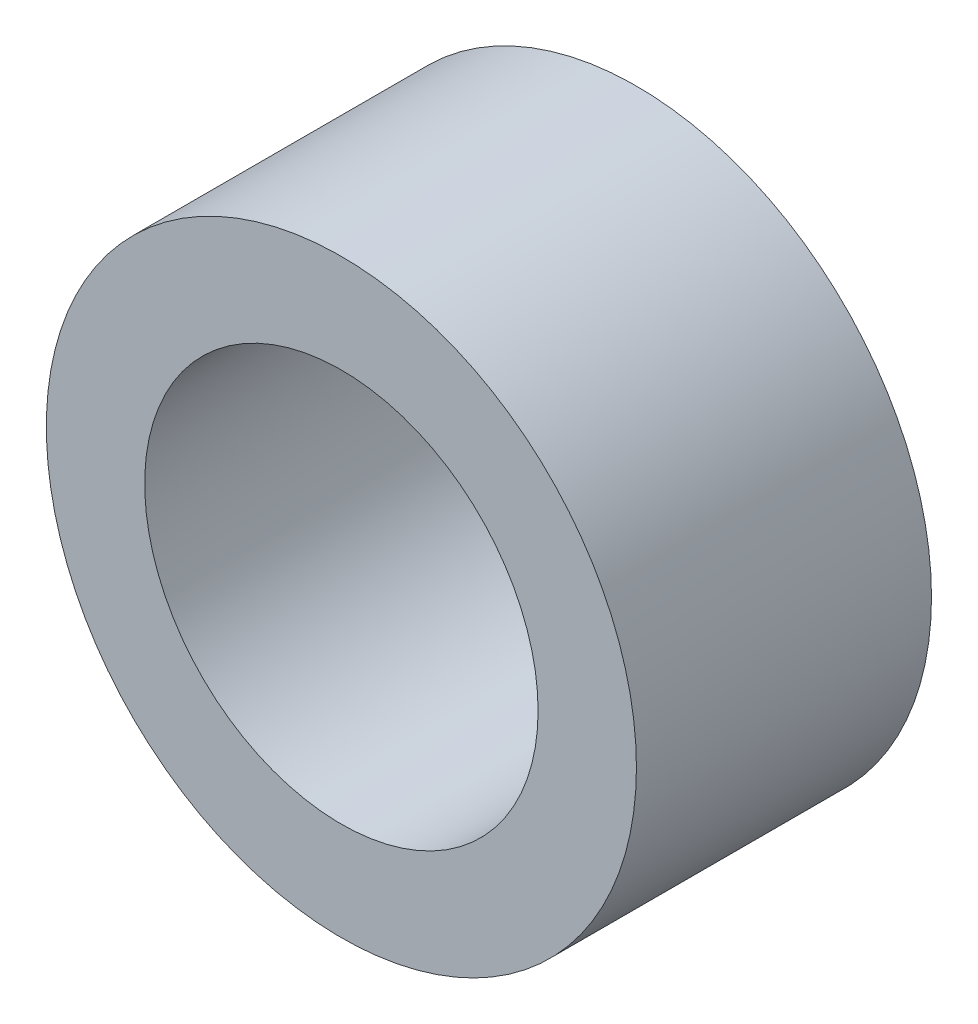
ISO-10303-21;
HEADER;
FILE_DESCRIPTION(('STEP AP214'),'2;1');
FILE_NAME('part.step','',(''),(''),'','','');
FILE_SCHEMA(('AUTOMOTIVE_DESIGN { 1 0 10303 214 1 1 1 1 }'));
ENDSEC;
DATA;
#1=APPLICATION_CONTEXT('core data for automotive mechanical design processes');
#2=APPLICATION_PROTOCOL_DEFINITION('international standard','automotive_design',2000,#1);
#3=PRODUCT_CONTEXT('',#1,'mechanical');
#4=PRODUCT('Part','Part','',(#3));
#5=PRODUCT_RELATED_PRODUCT_CATEGORY('part','',(#4));
#6=PRODUCT_DEFINITION_FORMATION('','',#4);
#7=PRODUCT_DEFINITION_CONTEXT('part definition',#1,'design');
#8=PRODUCT_DEFINITION('design','',#6,#7);
#9=PRODUCT_DEFINITION_SHAPE('','',#8);
#10=(LENGTH_UNIT() NAMED_UNIT(*) SI_UNIT(.MILLI.,.METRE.));
#11=(NAMED_UNIT(*) PLANE_ANGLE_UNIT() SI_UNIT($,.RADIAN.));
#12=(NAMED_UNIT(*) SI_UNIT($,.STERADIAN.) SOLID_ANGLE_UNIT());
#13=UNCERTAINTY_MEASURE_WITH_UNIT(LENGTH_MEASURE(1.E-05),#10,'distance_accuracy_value','');
#14=(GEOMETRIC_REPRESENTATION_CONTEXT(3) GLOBAL_UNCERTAINTY_ASSIGNED_CONTEXT((#13)) GLOBAL_UNIT_ASSIGNED_CONTEXT((#10,
#11,#12)) REPRESENTATION_CONTEXT('',''));
#15=CARTESIAN_POINT('',(0.,0.,0.));
#16=DIRECTION('',(0.,0.,1.));
#17=DIRECTION('',(1.,0.,0.));
#18=AXIS2_PLACEMENT_3D('',#15,#16,#17);
#19=CARTESIAN_POINT('',(0.,0.,-19.05));
#20=DIRECTION('',(0.,0.,1.));
#21=DIRECTION('',(1.,0.,0.));
#22=AXIS2_PLACEMENT_3D('',#19,#20,#21);
#23=CYLINDRICAL_SURFACE('',#22,38.1);
#24=CARTESIAN_POINT('',(0.,0.,-19.05));
#25=DIRECTION('',(0.,0.,1.));
#26=DIRECTION('',(1.,0.,0.));
#27=AXIS2_PLACEMENT_3D('',#24,#25,#26);
#28=CIRCLE('',#27,38.1);
#29=CARTESIAN_POINT('',(38.1,0.,-19.05));
#30=VERTEX_POINT('',#29);
#31=EDGE_CURVE('E10',#30,#30,#28,.T.);
#32=CARTESIAN_POINT('',(0.,0.,19.05));
#33=DIRECTION('',(0.,0.,1.));
#34=DIRECTION('',(1.,0.,0.));
#35=AXIS2_PLACEMENT_3D('',#32,#33,#34);
#36=CIRCLE('',#35,38.1);
#37=CARTESIAN_POINT('',(38.1,0.,19.05));
#38=VERTEX_POINT('',#37);
#39=EDGE_CURVE('E40',#38,#38,#36,.T.);
#40=CARTESIAN_POINT('',(38.1,0.,-19.05));
#41=CARTESIAN_POINT('',(38.1,0.,-18.653125));
#42=CARTESIAN_POINT('',(38.1,0.,-18.25625));
#43=CARTESIAN_POINT('',(38.1,0.,-17.4625));
#44=CARTESIAN_POINT('',(38.1,0.,-17.065625));
#45=CARTESIAN_POINT('',(38.1,0.,-16.271875));
#46=CARTESIAN_POINT('',(38.1,0.,-15.875));
#47=CARTESIAN_POINT('',(38.1,0.,-15.08125));
#48=CARTESIAN_POINT('',(38.1,0.,-14.684375));
#49=CARTESIAN_POINT('',(38.1,0.,-13.890625));
#50=CARTESIAN_POINT('',(38.1,0.,-13.49375));
#51=CARTESIAN_POINT('',(38.1,0.,-12.7));
#52=CARTESIAN_POINT('',(38.1,0.,-12.303125));
#53=CARTESIAN_POINT('',(38.1,0.,-11.509375));
#54=CARTESIAN_POINT('',(38.1,0.,-11.1125));
#55=CARTESIAN_POINT('',(38.1,0.,-10.31875));
#56=CARTESIAN_POINT('',(38.1,0.,-9.921875));
#57=CARTESIAN_POINT('',(38.1,0.,-9.128125));
#58=CARTESIAN_POINT('',(38.1,0.,-8.73125));
#59=CARTESIAN_POINT('',(38.1,0.,-7.9375));
#60=CARTESIAN_POINT('',(38.1,0.,-7.540625));
#61=CARTESIAN_POINT('',(38.1,0.,-6.746875));
#62=CARTESIAN_POINT('',(38.1,0.,-6.35));
#63=CARTESIAN_POINT('',(38.1,0.,-5.55625));
#64=CARTESIAN_POINT('',(38.1,0.,-5.159375));
#65=CARTESIAN_POINT('',(38.1,0.,-4.365625));
#66=CARTESIAN_POINT('',(38.1,0.,-3.96875));
#67=CARTESIAN_POINT('',(38.1,0.,-3.175));
#68=CARTESIAN_POINT('',(38.1,0.,-2.778125));
#69=CARTESIAN_POINT('',(38.1,0.,-1.984375));
#70=CARTESIAN_POINT('',(38.1,0.,-1.5875));
#71=CARTESIAN_POINT('',(38.1,0.,-0.79375));
#72=CARTESIAN_POINT('',(38.1,0.,-0.396875));
#73=CARTESIAN_POINT('',(38.1,0.,0.396875));
#74=CARTESIAN_POINT('',(38.1,0.,0.79375));
#75=CARTESIAN_POINT('',(38.1,0.,1.5875));
#76=CARTESIAN_POINT('',(38.1,0.,1.984375));
#77=CARTESIAN_POINT('',(38.1,0.,2.778125));
#78=CARTESIAN_POINT('',(38.1,0.,3.175));
#79=CARTESIAN_POINT('',(38.1,0.,3.96875));
#80=CARTESIAN_POINT('',(38.1,0.,4.365625));
#81=CARTESIAN_POINT('',(38.1,0.,5.159375));
#82=CARTESIAN_POINT('',(38.1,0.,5.55625));
#83=CARTESIAN_POINT('',(38.1,0.,6.35));
#84=CARTESIAN_POINT('',(38.1,0.,6.746875));
#85=CARTESIAN_POINT('',(38.1,0.,7.540625));
#86=CARTESIAN_POINT('',(38.1,0.,7.9375));
#87=CARTESIAN_POINT('',(38.1,0.,8.73125));
#88=CARTESIAN_POINT('',(38.1,0.,9.128125));
#89=CARTESIAN_POINT('',(38.1,0.,9.921875));
#90=CARTESIAN_POINT('',(38.1,0.,10.31875));
#91=CARTESIAN_POINT('',(38.1,0.,11.1125));
#92=CARTESIAN_POINT('',(38.1,0.,11.509375));
#93=CARTESIAN_POINT('',(38.1,0.,12.303125));
#94=CARTESIAN_POINT('',(38.1,0.,12.7));
#95=CARTESIAN_POINT('',(38.1,0.,13.49375));
#96=CARTESIAN_POINT('',(38.1,0.,13.890625));
#97=CARTESIAN_POINT('',(38.1,0.,14.684375));
#98=CARTESIAN_POINT('',(38.1,0.,15.08125));
#99=CARTESIAN_POINT('',(38.1,0.,15.875));
#100=CARTESIAN_POINT('',(38.1,0.,16.271875));
#101=CARTESIAN_POINT('',(38.1,0.,17.065625));
#102=CARTESIAN_POINT('',(38.1,0.,17.4625));
#103=CARTESIAN_POINT('',(38.1,0.,18.25625));
#104=CARTESIAN_POINT('',(38.1,0.,18.653125));
#105=CARTESIAN_POINT('',(38.1,0.,19.05));
#106=B_SPLINE_CURVE_WITH_KNOTS('',3,(#40,#41,#42,#43,#44,#45,#46,#47,#48,#49,#50,#51,#52,#53,
#54,#55,#56,#57,#58,#59,#60,#61,#62,#63,#64,#65,#66,#67,#68,#69,#70,#71,#72,#73,#74,#75,#76,#77,
#78,#79,#80,#81,#82,#83,#84,#85,#86,#87,#88,#89,#90,#91,#92,#93,#94,#95,#96,#97,#98,#99,#100,
#101,#102,#103,#104,#105),.UNSPECIFIED.,.F.,.F.,(4,2,2,2,2,2,2,2,2,2,2,2,2,2,2,2,2,2,2,2,2,2,2,
2,2,2,2,2,2,2,2,2,4),(0.,1.190625,2.38125,3.571875,4.7625,5.953125,7.14375,8.334375,9.525,
10.715625,11.90625,13.096875,14.2875,15.478125,16.66875,17.859375,19.05,20.240625,21.43125,
22.621875,23.8125,25.003125,26.19375,27.384375,28.575,29.765625,30.95625,32.146875,33.3375,
34.528125,35.71875,36.909375,38.1),.UNSPECIFIED.);
#107=EDGE_CURVE('BSEAM37',#30,#38,#106,.T.);
#108=ORIENTED_EDGE('',*,*,#31,.T.);
#109=ORIENTED_EDGE('',*,*,#39,.F.);
#110=ORIENTED_EDGE('',*,*,#107,.T.);
#111=ORIENTED_EDGE('',*,*,#107,.F.);
#112=EDGE_LOOP('',(#108,#110,#109,#111));
#113=FACE_BOUND('',#112,.T.);
#114=ADVANCED_FACE('F37',(#113),#23,.T.);
#115=CARTESIAN_POINT('',(0.,0.,-19.05));
#116=DIRECTION('',(0.,0.,1.));
#117=DIRECTION('',(1.,0.,0.));
#118=AXIS2_PLACEMENT_3D('',#115,#116,#117);
#119=PLANE('',#118);
#120=CARTESIAN_POINT('',(0.,0.,-19.05));
#121=DIRECTION('',(0.,0.,1.));
#122=DIRECTION('',(1.,0.,0.));
#123=AXIS2_PLACEMENT_3D('',#120,#121,#122);
#124=CIRCLE('',#123,25.4);
#125=CARTESIAN_POINT('',(25.4,0.,-19.05));
#126=VERTEX_POINT('',#125);
#127=EDGE_CURVE('E49',#126,#126,#124,.T.);
#128=ORIENTED_EDGE('',*,*,#127,.T.);
#129=EDGE_LOOP('',(#128));
#130=FACE_BOUND('',#129,.T.);
#131=ORIENTED_EDGE('',*,*,#31,.F.);
#132=EDGE_LOOP('',(#131));
#133=FACE_BOUND('',#132,.T.);
#134=ADVANCED_FACE('F59',(#130,#133),#119,.F.);
#135=CARTESIAN_POINT('',(0.,0.,19.05));
#136=DIRECTION('',(0.,0.,1.));
#137=DIRECTION('',(1.,0.,0.));
#138=AXIS2_PLACEMENT_3D('',#135,#136,#137);
#139=PLANE('',#138);
#140=CARTESIAN_POINT('',(0.,0.,19.05));
#141=DIRECTION('',(0.,0.,1.));
#142=DIRECTION('',(1.,0.,0.));
#143=AXIS2_PLACEMENT_3D('',#140,#141,#142);
#144=CIRCLE('',#143,25.4);
#145=CARTESIAN_POINT('',(25.4,0.,19.05));
#146=VERTEX_POINT('',#145);
#147=EDGE_CURVE('E51',#146,#146,#144,.T.);
#148=ORIENTED_EDGE('',*,*,#147,.F.);
#149=EDGE_LOOP('',(#148));
#150=FACE_BOUND('',#149,.T.);
#151=ORIENTED_EDGE('',*,*,#39,.T.);
#152=EDGE_LOOP('',(#151));
#153=FACE_BOUND('',#152,.T.);
#154=ADVANCED_FACE('F65',(#150,#153),#139,.T.);
#155=CARTESIAN_POINT('',(0.,0.,-19.05));
#156=DIRECTION('',(0.,0.,1.));
#157=DIRECTION('',(1.,0.,0.));
#158=AXIS2_PLACEMENT_3D('',#155,#156,#157);
#159=CYLINDRICAL_SURFACE('',#158,25.4);
#160=CARTESIAN_POINT('',(25.4,0.,-19.05));
#161=CARTESIAN_POINT('',(25.4,0.,-18.653125));
#162=CARTESIAN_POINT('',(25.4,0.,-18.25625));
#163=CARTESIAN_POINT('',(25.4,0.,-17.4625));
#164=CARTESIAN_POINT('',(25.4,0.,-17.065625));
#165=CARTESIAN_POINT('',(25.4,0.,-16.271875));
#166=CARTESIAN_POINT('',(25.4,0.,-15.875));
#167=CARTESIAN_POINT('',(25.4,0.,-15.08125));
#168=CARTESIAN_POINT('',(25.4,0.,-14.684375));
#169=CARTESIAN_POINT('',(25.4,0.,-13.890625));
#170=CARTESIAN_POINT('',(25.4,0.,-13.49375));
#171=CARTESIAN_POINT('',(25.4,0.,-12.7));
#172=CARTESIAN_POINT('',(25.4,0.,-12.303125));
#173=CARTESIAN_POINT('',(25.4,0.,-11.509375));
#174=CARTESIAN_POINT('',(25.4,0.,-11.1125));
#175=CARTESIAN_POINT('',(25.4,0.,-10.31875));
#176=CARTESIAN_POINT('',(25.4,0.,-9.921875));
#177=CARTESIAN_POINT('',(25.4,0.,-9.128125));
#178=CARTESIAN_POINT('',(25.4,0.,-8.73125));
#179=CARTESIAN_POINT('',(25.4,0.,-7.9375));
#180=CARTESIAN_POINT('',(25.4,0.,-7.540625));
#181=CARTESIAN_POINT('',(25.4,0.,-6.746875));
#182=CARTESIAN_POINT('',(25.4,0.,-6.35));
#183=CARTESIAN_POINT('',(25.4,0.,-5.55625));
#184=CARTESIAN_POINT('',(25.4,0.,-5.159375));
#185=CARTESIAN_POINT('',(25.4,0.,-4.365625));
#186=CARTESIAN_POINT('',(25.4,0.,-3.96875));
#187=CARTESIAN_POINT('',(25.4,0.,-3.175));
#188=CARTESIAN_POINT('',(25.4,0.,-2.778125));
#189=CARTESIAN_POINT('',(25.4,0.,-1.984375));
#190=CARTESIAN_POINT('',(25.4,0.,-1.5875));
#191=CARTESIAN_POINT('',(25.4,0.,-0.793750000000004));
#192=CARTESIAN_POINT('',(25.4,0.,-0.396875000000004));
#193=CARTESIAN_POINT('',(25.4,0.,0.396874999999997));
#194=CARTESIAN_POINT('',(25.4,0.,0.793749999999997));
#195=CARTESIAN_POINT('',(25.4,0.,1.5875));
#196=CARTESIAN_POINT('',(25.4,0.,1.984375));
#197=CARTESIAN_POINT('',(25.4,0.,2.778125));
#198=CARTESIAN_POINT('',(25.4,0.,3.175));
#199=CARTESIAN_POINT('',(25.4,0.,3.96875));
#200=CARTESIAN_POINT('',(25.4,0.,4.365625));
#201=CARTESIAN_POINT('',(25.4,0.,5.159375));
#202=CARTESIAN_POINT('',(25.4,0.,5.55625));
#203=CARTESIAN_POINT('',(25.4,0.,6.35));
#204=CARTESIAN_POINT('',(25.4,0.,6.746875));
#205=CARTESIAN_POINT('',(25.4,0.,7.540625));
#206=CARTESIAN_POINT('',(25.4,0.,7.9375));
#207=CARTESIAN_POINT('',(25.4,0.,8.73125));
#208=CARTESIAN_POINT('',(25.4,0.,9.128125));
#209=CARTESIAN_POINT('',(25.4,0.,9.921875));
#210=CARTESIAN_POINT('',(25.4,0.,10.31875));
#211=CARTESIAN_POINT('',(25.4,0.,11.1125));
#212=CARTESIAN_POINT('',(25.4,0.,11.509375));
#213=CARTESIAN_POINT('',(25.4,0.,12.303125));
#214=CARTESIAN_POINT('',(25.4,0.,12.7));
#215=CARTESIAN_POINT('',(25.4,0.,13.49375));
#216=CARTESIAN_POINT('',(25.4,0.,13.890625));
#217=CARTESIAN_POINT('',(25.4,0.,14.684375));
#218=CARTESIAN_POINT('',(25.4,0.,15.08125));
#219=CARTESIAN_POINT('',(25.4,0.,15.875));
#220=CARTESIAN_POINT('',(25.4,0.,16.271875));
#221=CARTESIAN_POINT('',(25.4,0.,17.065625));
#222=CARTESIAN_POINT('',(25.4,0.,17.4625));
#223=CARTESIAN_POINT('',(25.4,0.,18.25625));
#224=CARTESIAN_POINT('',(25.4,0.,18.653125));
#225=CARTESIAN_POINT('',(25.4,0.,19.05));
#226=B_SPLINE_CURVE_WITH_KNOTS('',3,(#160,#161,#162,#163,#164,#165,#166,#167,#168,#169,#170,
#171,#172,#173,#174,#175,#176,#177,#178,#179,#180,#181,#182,#183,#184,#185,#186,#187,#188,#189,
#190,#191,#192,#193,#194,#195,#196,#197,#198,#199,#200,#201,#202,#203,#204,#205,#206,#207,#208,
#209,#210,#211,#212,#213,#214,#215,#216,#217,#218,#219,#220,#221,#222,#223,#224,#225),
.UNSPECIFIED.,.F.,.F.,(4,2,2,2,2,2,2,2,2,2,2,2,2,2,2,2,2,2,2,2,2,2,2,2,2,2,2,2,2,2,2,2,4),(0.,
1.190625,2.38125,3.571875,4.7625,5.953125,7.14375,8.334375,9.525,10.715625,11.90625,13.096875,
14.2875,15.478125,16.66875,17.859375,19.05,20.240625,21.43125,22.621875,23.8125,25.003125,
26.19375,27.384375,28.575,29.765625,30.95625,32.146875,33.3375,34.528125,35.71875,36.909375,
38.1),.UNSPECIFIED.);
#227=EDGE_CURVE('BSEAM62',#126,#146,#226,.T.);
#228=ORIENTED_EDGE('',*,*,#127,.F.);
#229=ORIENTED_EDGE('',*,*,#147,.T.);
#230=ORIENTED_EDGE('',*,*,#227,.T.);
#231=ORIENTED_EDGE('',*,*,#227,.F.);
#232=EDGE_LOOP('',(#228,#230,#229,#231));
#233=FACE_BOUND('',#232,.T.);
#234=ADVANCED_FACE('F62',(#233),#159,.F.);
#235=CLOSED_SHELL('',(#114,#134,#154,#234));
#236=MANIFOLD_SOLID_BREP('B2',#235);
#237=ADVANCED_BREP_SHAPE_REPRESENTATION('',(#18,#236),#14);
#238=SHAPE_DEFINITION_REPRESENTATION(#9,#237);
ENDSEC;
END-ISO-10303-21;
